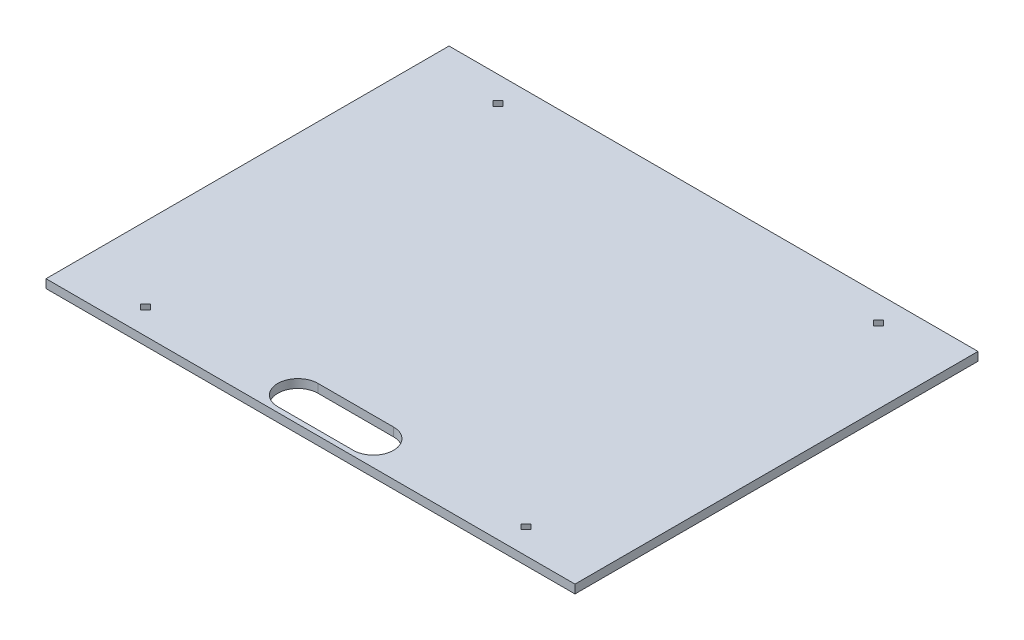
ISO-10303-21;
HEADER;
FILE_DESCRIPTION(('STEP AP214'),'2;1');
FILE_NAME('part.step','',(''),(''),'','','');
FILE_SCHEMA(('AUTOMOTIVE_DESIGN { 1 0 10303 214 1 1 1 1 }'));
ENDSEC;
DATA;
#1=APPLICATION_CONTEXT('core data for automotive mechanical design processes');
#2=APPLICATION_PROTOCOL_DEFINITION('international standard','automotive_design',2000,#1);
#3=PRODUCT_CONTEXT('',#1,'mechanical');
#4=PRODUCT('Part','Part','',(#3));
#5=PRODUCT_RELATED_PRODUCT_CATEGORY('part','',(#4));
#6=PRODUCT_DEFINITION_FORMATION('','',#4);
#7=PRODUCT_DEFINITION_CONTEXT('part definition',#1,'design');
#8=PRODUCT_DEFINITION('design','',#6,#7);
#9=PRODUCT_DEFINITION_SHAPE('','',#8);
#10=(LENGTH_UNIT() NAMED_UNIT(*) SI_UNIT(.MILLI.,.METRE.));
#11=(NAMED_UNIT(*) PLANE_ANGLE_UNIT() SI_UNIT($,.RADIAN.));
#12=(NAMED_UNIT(*) SI_UNIT($,.STERADIAN.) SOLID_ANGLE_UNIT());
#13=UNCERTAINTY_MEASURE_WITH_UNIT(LENGTH_MEASURE(1.E-05),#10,'distance_accuracy_value','');
#14=(GEOMETRIC_REPRESENTATION_CONTEXT(3) GLOBAL_UNCERTAINTY_ASSIGNED_CONTEXT((#13)) GLOBAL_UNIT_ASSIGNED_CONTEXT((#10,
#11,#12)) REPRESENTATION_CONTEXT('',''));
#15=CARTESIAN_POINT('',(0.,0.,0.));
#16=DIRECTION('',(0.,0.,1.));
#17=DIRECTION('',(1.,0.,0.));
#18=AXIS2_PLACEMENT_3D('',#15,#16,#17);
#19=CARTESIAN_POINT('',(0.,1.70233786755635,0.));
#20=DIRECTION('',(0.,1.,0.));
#21=DIRECTION('',(0.,0.,1.));
#22=AXIS2_PLACEMENT_3D('',#19,#20,#21);
#23=PLANE('',#22);
#24=DIRECTION('',(0.,0.,-1.));
#25=VECTOR('',#24,1.);
#26=CARTESIAN_POINT('',(52.5,1.70233786755635,-40.));
#27=LINE('',#26,#25);
#28=CARTESIAN_POINT('',(52.5,1.70233786755635,40.));
#29=VERTEX_POINT('',#28);
#30=CARTESIAN_POINT('',(52.5,1.70233786755635,-40.));
#31=VERTEX_POINT('',#30);
#32=EDGE_CURVE('E362',#29,#31,#27,.T.);
#33=ORIENTED_EDGE('',*,*,#32,.T.);
#34=DIRECTION('',(-1.,0.,0.));
#35=VECTOR('',#34,1.);
#36=CARTESIAN_POINT('',(-52.5,1.70233786755635,-40.));
#37=LINE('',#36,#35);
#38=CARTESIAN_POINT('',(-52.5,1.70233786755635,-40.));
#39=VERTEX_POINT('',#38);
#40=EDGE_CURVE('E365',#31,#39,#37,.T.);
#41=ORIENTED_EDGE('',*,*,#40,.T.);
#42=DIRECTION('',(0.,0.,1.));
#43=VECTOR('',#42,1.);
#44=CARTESIAN_POINT('',(-52.5,1.70233786755635,-40.));
#45=LINE('',#44,#43);
#46=CARTESIAN_POINT('',(-52.5,1.70233786755635,40.));
#47=VERTEX_POINT('',#46);
#48=EDGE_CURVE('E368',#39,#47,#45,.T.);
#49=ORIENTED_EDGE('',*,*,#48,.T.);
#50=DIRECTION('',(1.,0.,0.));
#51=VECTOR('',#50,1.);
#52=CARTESIAN_POINT('',(-52.5,1.70233786755635,40.));
#53=LINE('',#52,#51);
#54=EDGE_CURVE('E370',#47,#29,#53,.T.);
#55=ORIENTED_EDGE('',*,*,#54,.T.);
#56=EDGE_LOOP('',(#33,#41,#49,#55));
#57=FACE_BOUND('',#56,.T.);
#58=DIRECTION('',(0.707106781186547,0.,-0.707106781186547));
#59=VECTOR('',#58,1.);
#60=CARTESIAN_POINT('',(-37.7592881778876,1.70233786755635,-34.));
#61=LINE('',#60,#59);
#62=CARTESIAN_POINT('',(-37.7592881778876,1.70233786755635,-34.));
#63=VERTEX_POINT('',#62);
#64=CARTESIAN_POINT('',(-36.7592881778876,1.70233786755635,-35.));
#65=VERTEX_POINT('',#64);
#66=EDGE_CURVE('E333',#63,#65,#61,.T.);
#67=ORIENTED_EDGE('',*,*,#66,.F.);
#68=DIRECTION('',(0.707106781186547,0.,0.707106781186547));
#69=VECTOR('',#68,1.);
#70=CARTESIAN_POINT('',(-38.7592881778876,1.70233786755635,-35.));
#71=LINE('',#70,#69);
#72=CARTESIAN_POINT('',(-38.7592881778876,1.70233786755635,-35.));
#73=VERTEX_POINT('',#72);
#74=EDGE_CURVE('E331',#73,#63,#71,.T.);
#75=ORIENTED_EDGE('',*,*,#74,.F.);
#76=DIRECTION('',(-0.707106781186545,0.,0.70710678118655));
#77=VECTOR('',#76,1.);
#78=CARTESIAN_POINT('',(-37.7592881778876,1.70233786755635,-36.));
#79=LINE('',#78,#77);
#80=CARTESIAN_POINT('',(-37.7592881778876,1.70233786755635,-36.));
#81=VERTEX_POINT('',#80);
#82=EDGE_CURVE('E339',#81,#73,#79,.T.);
#83=ORIENTED_EDGE('',*,*,#82,.F.);
#84=DIRECTION('',(-0.70710678118655,0.,-0.707106781186545));
#85=VECTOR('',#84,1.);
#86=CARTESIAN_POINT('',(-36.7592881778876,1.70233786755635,-35.));
#87=LINE('',#86,#85);
#88=EDGE_CURVE('E336',#65,#81,#87,.T.);
#89=ORIENTED_EDGE('',*,*,#88,.F.);
#90=EDGE_LOOP('',(#67,#75,#83,#89));
#91=FACE_BOUND('',#90,.T.);
#92=DIRECTION('',(-0.70710678118655,0.,0.707106781186545));
#93=VECTOR('',#92,1.);
#94=CARTESIAN_POINT('',(36.7592881778876,1.70233786755635,-35.));
#95=LINE('',#94,#93);
#96=CARTESIAN_POINT('',(37.7592881778876,1.70233786755635,-36.));
#97=VERTEX_POINT('',#96);
#98=CARTESIAN_POINT('',(36.7592881778876,1.70233786755635,-35.));
#99=VERTEX_POINT('',#98);
#100=EDGE_CURVE('E302',#97,#99,#95,.T.);
#101=ORIENTED_EDGE('',*,*,#100,.F.);
#102=DIRECTION('',(-0.707106781186545,0.,-0.70710678118655));
#103=VECTOR('',#102,1.);
#104=CARTESIAN_POINT('',(37.7592881778876,1.70233786755635,-36.));
#105=LINE('',#104,#103);
#106=CARTESIAN_POINT('',(38.7592881778876,1.70233786755635,-35.));
#107=VERTEX_POINT('',#106);
#108=EDGE_CURVE('E300',#107,#97,#105,.T.);
#109=ORIENTED_EDGE('',*,*,#108,.F.);
#110=DIRECTION('',(0.707106781186547,0.,-0.707106781186547));
#111=VECTOR('',#110,1.);
#112=CARTESIAN_POINT('',(38.7592881778876,1.70233786755635,-35.));
#113=LINE('',#112,#111);
#114=CARTESIAN_POINT('',(37.7592881778876,1.70233786755635,-34.));
#115=VERTEX_POINT('',#114);
#116=EDGE_CURVE('E308',#115,#107,#113,.T.);
#117=ORIENTED_EDGE('',*,*,#116,.F.);
#118=DIRECTION('',(0.707106781186547,0.,0.707106781186547));
#119=VECTOR('',#118,1.);
#120=CARTESIAN_POINT('',(37.7592881778876,1.70233786755635,-34.));
#121=LINE('',#120,#119);
#122=EDGE_CURVE('E305',#99,#115,#121,.T.);
#123=ORIENTED_EDGE('',*,*,#122,.F.);
#124=EDGE_LOOP('',(#101,#109,#117,#123));
#125=FACE_BOUND('',#124,.T.);
#126=DIRECTION('',(0.707106781186545,0.,-0.70710678118655));
#127=VECTOR('',#126,1.);
#128=CARTESIAN_POINT('',(37.7592881778876,1.70233786755635,36.));
#129=LINE('',#128,#127);
#130=CARTESIAN_POINT('',(37.7592881778876,1.70233786755635,36.));
#131=VERTEX_POINT('',#130);
#132=CARTESIAN_POINT('',(38.7592881778876,1.70233786755635,35.));
#133=VERTEX_POINT('',#132);
#134=EDGE_CURVE('E271',#131,#133,#129,.T.);
#135=ORIENTED_EDGE('',*,*,#134,.F.);
#136=DIRECTION('',(0.70710678118655,0.,0.707106781186545));
#137=VECTOR('',#136,1.);
#138=CARTESIAN_POINT('',(36.7592881778876,1.70233786755635,35.));
#139=LINE('',#138,#137);
#140=CARTESIAN_POINT('',(36.7592881778876,1.70233786755635,35.));
#141=VERTEX_POINT('',#140);
#142=EDGE_CURVE('E269',#141,#131,#139,.T.);
#143=ORIENTED_EDGE('',*,*,#142,.F.);
#144=DIRECTION('',(-0.707106781186547,0.,0.707106781186547));
#145=VECTOR('',#144,1.);
#146=CARTESIAN_POINT('',(37.7592881778876,1.70233786755635,34.));
#147=LINE('',#146,#145);
#148=CARTESIAN_POINT('',(37.7592881778876,1.70233786755635,34.));
#149=VERTEX_POINT('',#148);
#150=EDGE_CURVE('E277',#149,#141,#147,.T.);
#151=ORIENTED_EDGE('',*,*,#150,.F.);
#152=DIRECTION('',(-0.707106781186547,0.,-0.707106781186547));
#153=VECTOR('',#152,1.);
#154=CARTESIAN_POINT('',(38.7592881778876,1.70233786755635,35.));
#155=LINE('',#154,#153);
#156=EDGE_CURVE('E274',#133,#149,#155,.T.);
#157=ORIENTED_EDGE('',*,*,#156,.F.);
#158=EDGE_LOOP('',(#135,#143,#151,#157));
#159=FACE_BOUND('',#158,.T.);
#160=DIRECTION('',(0.70710678118655,0.,-0.707106781186545));
#161=VECTOR('',#160,1.);
#162=CARTESIAN_POINT('',(-36.7592881778876,1.70233786755635,35.));
#163=LINE('',#162,#161);
#164=CARTESIAN_POINT('',(-37.7592881778876,1.70233786755635,36.));
#165=VERTEX_POINT('',#164);
#166=CARTESIAN_POINT('',(-36.7592881778876,1.70233786755635,35.));
#167=VERTEX_POINT('',#166);
#168=EDGE_CURVE('E240',#165,#167,#163,.T.);
#169=ORIENTED_EDGE('',*,*,#168,.F.);
#170=DIRECTION('',(0.707106781186545,0.,0.70710678118655));
#171=VECTOR('',#170,1.);
#172=CARTESIAN_POINT('',(-37.7592881778876,1.70233786755635,36.));
#173=LINE('',#172,#171);
#174=CARTESIAN_POINT('',(-38.7592881778876,1.70233786755635,35.));
#175=VERTEX_POINT('',#174);
#176=EDGE_CURVE('E238',#175,#165,#173,.T.);
#177=ORIENTED_EDGE('',*,*,#176,.F.);
#178=DIRECTION('',(-0.707106781186547,0.,0.707106781186547));
#179=VECTOR('',#178,1.);
#180=CARTESIAN_POINT('',(-38.7592881778876,1.70233786755635,35.));
#181=LINE('',#180,#179);
#182=CARTESIAN_POINT('',(-37.7592881778876,1.70233786755635,34.));
#183=VERTEX_POINT('',#182);
#184=EDGE_CURVE('E246',#183,#175,#181,.T.);
#185=ORIENTED_EDGE('',*,*,#184,.F.);
#186=DIRECTION('',(-0.707106781186547,0.,-0.707106781186547));
#187=VECTOR('',#186,1.);
#188=CARTESIAN_POINT('',(-37.7592881778876,1.70233786755635,34.));
#189=LINE('',#188,#187);
#190=EDGE_CURVE('E243',#167,#183,#189,.T.);
#191=ORIENTED_EDGE('',*,*,#190,.F.);
#192=EDGE_LOOP('',(#169,#177,#185,#191));
#193=FACE_BOUND('',#192,.T.);
#194=DIRECTION('',(1.,0.,0.));
#195=VECTOR('',#194,1.);
#196=CARTESIAN_POINT('',(-7.5,1.70233786755635,39.));
#197=LINE('',#196,#195);
#198=CARTESIAN_POINT('',(-7.5,1.70233786755635,39.));
#199=VERTEX_POINT('',#198);
#200=CARTESIAN_POINT('',(7.5,1.70233786755635,39.));
#201=VERTEX_POINT('',#200);
#202=EDGE_CURVE('E210',#199,#201,#197,.T.);
#203=ORIENTED_EDGE('',*,*,#202,.F.);
#204=CARTESIAN_POINT('',(-7.5,1.70233786755635,35.));
#205=DIRECTION('',(0.,1.,0.));
#206=DIRECTION('',(0.,0.,-1.));
#207=AXIS2_PLACEMENT_3D('',#204,#205,#206);
#208=CIRCLE('',#207,4.);
#209=CARTESIAN_POINT('',(-7.5,1.70233786755635,31.));
#210=VERTEX_POINT('',#209);
#211=EDGE_CURVE('E202',#210,#199,#208,.T.);
#212=ORIENTED_EDGE('',*,*,#211,.F.);
#213=DIRECTION('',(-1.,0.,0.));
#214=VECTOR('',#213,1.);
#215=CARTESIAN_POINT('',(-7.5,1.70233786755635,31.));
#216=LINE('',#215,#214);
#217=CARTESIAN_POINT('',(7.5,1.70233786755635,31.));
#218=VERTEX_POINT('',#217);
#219=EDGE_CURVE('E224',#218,#210,#216,.T.);
#220=ORIENTED_EDGE('',*,*,#219,.F.);
#221=CARTESIAN_POINT('',(7.5,1.70233786755635,35.));
#222=DIRECTION('',(0.,1.,0.));
#223=DIRECTION('',(0.,0.,-1.));
#224=AXIS2_PLACEMENT_3D('',#221,#222,#223);
#225=CIRCLE('',#224,4.);
#226=EDGE_CURVE('E222',#201,#218,#225,.T.);
#227=ORIENTED_EDGE('',*,*,#226,.F.);
#228=EDGE_LOOP('',(#203,#212,#220,#227));
#229=FACE_BOUND('',#228,.T.);
#230=ADVANCED_FACE('F41',(#57,#91,#125,#159,#193,#229),#23,.T.);
#231=CARTESIAN_POINT('',(0.,0.,0.));
#232=DIRECTION('',(0.,1.,0.));
#233=DIRECTION('',(0.,0.,1.));
#234=AXIS2_PLACEMENT_3D('',#231,#232,#233);
#235=PLANE('',#234);
#236=DIRECTION('',(0.707106781186545,0.,0.70710678118655));
#237=VECTOR('',#236,1.);
#238=CARTESIAN_POINT('',(-37.7592881778876,0.,36.));
#239=LINE('',#238,#237);
#240=CARTESIAN_POINT('',(-38.7592881778876,0.,35.));
#241=VERTEX_POINT('',#240);
#242=CARTESIAN_POINT('',(-37.7592881778876,0.,36.));
#243=VERTEX_POINT('',#242);
#244=EDGE_CURVE('E218',#241,#243,#239,.T.);
#245=ORIENTED_EDGE('',*,*,#244,.T.);
#246=DIRECTION('',(0.70710678118655,0.,-0.707106781186545));
#247=VECTOR('',#246,1.);
#248=CARTESIAN_POINT('',(-36.7592881778876,0.,35.));
#249=LINE('',#248,#247);
#250=CARTESIAN_POINT('',(-36.7592881778876,0.,35.));
#251=VERTEX_POINT('',#250);
#252=EDGE_CURVE('E251',#243,#251,#249,.T.);
#253=ORIENTED_EDGE('',*,*,#252,.T.);
#254=DIRECTION('',(-0.707106781186547,0.,-0.707106781186547));
#255=VECTOR('',#254,1.);
#256=CARTESIAN_POINT('',(-37.7592881778876,0.,34.));
#257=LINE('',#256,#255);
#258=CARTESIAN_POINT('',(-37.7592881778876,0.,34.));
#259=VERTEX_POINT('',#258);
#260=EDGE_CURVE('E254',#251,#259,#257,.T.);
#261=ORIENTED_EDGE('',*,*,#260,.T.);
#262=DIRECTION('',(-0.707106781186547,0.,0.707106781186547));
#263=VECTOR('',#262,1.);
#264=CARTESIAN_POINT('',(-38.7592881778876,0.,35.));
#265=LINE('',#264,#263);
#266=EDGE_CURVE('E241',#259,#241,#265,.T.);
#267=ORIENTED_EDGE('',*,*,#266,.T.);
#268=EDGE_LOOP('',(#245,#253,#261,#267));
#269=FACE_BOUND('',#268,.T.);
#270=DIRECTION('',(-0.707106781186545,0.,-0.70710678118655));
#271=VECTOR('',#270,1.);
#272=CARTESIAN_POINT('',(37.7592881778876,0.,-36.));
#273=LINE('',#272,#271);
#274=CARTESIAN_POINT('',(38.7592881778876,0.,-35.));
#275=VERTEX_POINT('',#274);
#276=CARTESIAN_POINT('',(37.7592881778876,0.,-36.));
#277=VERTEX_POINT('',#276);
#278=EDGE_CURVE('E299',#275,#277,#273,.T.);
#279=ORIENTED_EDGE('',*,*,#278,.T.);
#280=DIRECTION('',(-0.70710678118655,0.,0.707106781186545));
#281=VECTOR('',#280,1.);
#282=CARTESIAN_POINT('',(36.7592881778876,0.,-35.));
#283=LINE('',#282,#281);
#284=CARTESIAN_POINT('',(36.7592881778876,0.,-35.));
#285=VERTEX_POINT('',#284);
#286=EDGE_CURVE('E313',#277,#285,#283,.T.);
#287=ORIENTED_EDGE('',*,*,#286,.T.);
#288=DIRECTION('',(0.707106781186547,0.,0.707106781186547));
#289=VECTOR('',#288,1.);
#290=CARTESIAN_POINT('',(37.7592881778876,0.,-34.));
#291=LINE('',#290,#289);
#292=CARTESIAN_POINT('',(37.7592881778876,0.,-34.));
#293=VERTEX_POINT('',#292);
#294=EDGE_CURVE('E316',#285,#293,#291,.T.);
#295=ORIENTED_EDGE('',*,*,#294,.T.);
#296=DIRECTION('',(0.707106781186547,0.,-0.707106781186547));
#297=VECTOR('',#296,1.);
#298=CARTESIAN_POINT('',(38.7592881778876,0.,-35.));
#299=LINE('',#298,#297);
#300=EDGE_CURVE('E303',#293,#275,#299,.T.);
#301=ORIENTED_EDGE('',*,*,#300,.T.);
#302=EDGE_LOOP('',(#279,#287,#295,#301));
#303=FACE_BOUND('',#302,.T.);
#304=DIRECTION('',(0.,0.,-1.));
#305=VECTOR('',#304,1.);
#306=CARTESIAN_POINT('',(52.5,0.,-40.));
#307=LINE('',#306,#305);
#308=CARTESIAN_POINT('',(52.5,0.,40.));
#309=VERTEX_POINT('',#308);
#310=CARTESIAN_POINT('',(52.5,0.,-40.));
#311=VERTEX_POINT('',#310);
#312=EDGE_CURVE('E361',#309,#311,#307,.T.);
#313=ORIENTED_EDGE('',*,*,#312,.F.);
#314=DIRECTION('',(1.,0.,0.));
#315=VECTOR('',#314,1.);
#316=CARTESIAN_POINT('',(-52.5,0.,40.));
#317=LINE('',#316,#315);
#318=CARTESIAN_POINT('',(-52.5,0.,40.));
#319=VERTEX_POINT('',#318);
#320=EDGE_CURVE('E366',#319,#309,#317,.T.);
#321=ORIENTED_EDGE('',*,*,#320,.F.);
#322=DIRECTION('',(0.,0.,1.));
#323=VECTOR('',#322,1.);
#324=CARTESIAN_POINT('',(-52.5,0.,-40.));
#325=LINE('',#324,#323);
#326=CARTESIAN_POINT('',(-52.5,0.,-40.));
#327=VERTEX_POINT('',#326);
#328=EDGE_CURVE('E377',#327,#319,#325,.T.);
#329=ORIENTED_EDGE('',*,*,#328,.F.);
#330=DIRECTION('',(-1.,0.,0.));
#331=VECTOR('',#330,1.);
#332=CARTESIAN_POINT('',(-52.5,0.,-40.));
#333=LINE('',#332,#331);
#334=EDGE_CURVE('E375',#311,#327,#333,.T.);
#335=ORIENTED_EDGE('',*,*,#334,.F.);
#336=EDGE_LOOP('',(#313,#321,#329,#335));
#337=FACE_BOUND('',#336,.T.);
#338=DIRECTION('',(0.707106781186547,0.,0.707106781186547));
#339=VECTOR('',#338,1.);
#340=CARTESIAN_POINT('',(-38.7592881778876,0.,-35.));
#341=LINE('',#340,#339);
#342=CARTESIAN_POINT('',(-38.7592881778876,0.,-35.));
#343=VERTEX_POINT('',#342);
#344=CARTESIAN_POINT('',(-37.7592881778876,0.,-34.));
#345=VERTEX_POINT('',#344);
#346=EDGE_CURVE('E330',#343,#345,#341,.T.);
#347=ORIENTED_EDGE('',*,*,#346,.T.);
#348=DIRECTION('',(0.707106781186547,0.,-0.707106781186547));
#349=VECTOR('',#348,1.);
#350=CARTESIAN_POINT('',(-37.7592881778876,0.,-34.));
#351=LINE('',#350,#349);
#352=CARTESIAN_POINT('',(-36.7592881778876,0.,-35.));
#353=VERTEX_POINT('',#352);
#354=EDGE_CURVE('E344',#345,#353,#351,.T.);
#355=ORIENTED_EDGE('',*,*,#354,.T.);
#356=DIRECTION('',(-0.70710678118655,0.,-0.707106781186545));
#357=VECTOR('',#356,1.);
#358=CARTESIAN_POINT('',(-36.7592881778876,0.,-35.));
#359=LINE('',#358,#357);
#360=CARTESIAN_POINT('',(-37.7592881778876,0.,-36.));
#361=VERTEX_POINT('',#360);
#362=EDGE_CURVE('E347',#353,#361,#359,.T.);
#363=ORIENTED_EDGE('',*,*,#362,.T.);
#364=DIRECTION('',(-0.707106781186545,0.,0.70710678118655));
#365=VECTOR('',#364,1.);
#366=CARTESIAN_POINT('',(-37.7592881778876,0.,-36.));
#367=LINE('',#366,#365);
#368=EDGE_CURVE('E334',#361,#343,#367,.T.);
#369=ORIENTED_EDGE('',*,*,#368,.T.);
#370=EDGE_LOOP('',(#347,#355,#363,#369));
#371=FACE_BOUND('',#370,.T.);
#372=DIRECTION('',(0.70710678118655,0.,0.707106781186545));
#373=VECTOR('',#372,1.);
#374=CARTESIAN_POINT('',(36.7592881778876,0.,35.));
#375=LINE('',#374,#373);
#376=CARTESIAN_POINT('',(36.7592881778876,0.,35.));
#377=VERTEX_POINT('',#376);
#378=CARTESIAN_POINT('',(37.7592881778876,0.,36.));
#379=VERTEX_POINT('',#378);
#380=EDGE_CURVE('E268',#377,#379,#375,.T.);
#381=ORIENTED_EDGE('',*,*,#380,.T.);
#382=DIRECTION('',(0.707106781186545,0.,-0.70710678118655));
#383=VECTOR('',#382,1.);
#384=CARTESIAN_POINT('',(37.7592881778876,0.,36.));
#385=LINE('',#384,#383);
#386=CARTESIAN_POINT('',(38.7592881778876,0.,35.));
#387=VERTEX_POINT('',#386);
#388=EDGE_CURVE('E282',#379,#387,#385,.T.);
#389=ORIENTED_EDGE('',*,*,#388,.T.);
#390=DIRECTION('',(-0.707106781186547,0.,-0.707106781186547));
#391=VECTOR('',#390,1.);
#392=CARTESIAN_POINT('',(38.7592881778876,0.,35.));
#393=LINE('',#392,#391);
#394=CARTESIAN_POINT('',(37.7592881778876,0.,34.));
#395=VERTEX_POINT('',#394);
#396=EDGE_CURVE('E285',#387,#395,#393,.T.);
#397=ORIENTED_EDGE('',*,*,#396,.T.);
#398=DIRECTION('',(-0.707106781186547,0.,0.707106781186547));
#399=VECTOR('',#398,1.);
#400=CARTESIAN_POINT('',(37.7592881778876,0.,34.));
#401=LINE('',#400,#399);
#402=EDGE_CURVE('E272',#395,#377,#401,.T.);
#403=ORIENTED_EDGE('',*,*,#402,.T.);
#404=EDGE_LOOP('',(#381,#389,#397,#403));
#405=FACE_BOUND('',#404,.T.);
#406=CARTESIAN_POINT('',(-7.5,0.,35.));
#407=DIRECTION('',(0.,1.,0.));
#408=DIRECTION('',(0.,0.,-1.));
#409=AXIS2_PLACEMENT_3D('',#406,#407,#408);
#410=CIRCLE('',#409,4.);
#411=CARTESIAN_POINT('',(-7.5,0.,31.));
#412=VERTEX_POINT('',#411);
#413=CARTESIAN_POINT('',(-7.5,0.,39.));
#414=VERTEX_POINT('',#413);
#415=EDGE_CURVE('E64',#412,#414,#410,.T.);
#416=ORIENTED_EDGE('',*,*,#415,.T.);
#417=DIRECTION('',(1.,0.,0.));
#418=VECTOR('',#417,1.);
#419=CARTESIAN_POINT('',(-7.5,0.,39.));
#420=LINE('',#419,#418);
#421=CARTESIAN_POINT('',(7.5,0.,39.));
#422=VERTEX_POINT('',#421);
#423=EDGE_CURVE('E217',#414,#422,#420,.T.);
#424=ORIENTED_EDGE('',*,*,#423,.T.);
#425=CARTESIAN_POINT('',(7.5,0.,35.));
#426=DIRECTION('',(0.,1.,0.));
#427=DIRECTION('',(0.,0.,-1.));
#428=AXIS2_PLACEMENT_3D('',#425,#426,#427);
#429=CIRCLE('',#428,4.);
#430=CARTESIAN_POINT('',(7.5,0.,31.));
#431=VERTEX_POINT('',#430);
#432=EDGE_CURVE('E230',#422,#431,#429,.T.);
#433=ORIENTED_EDGE('',*,*,#432,.T.);
#434=DIRECTION('',(-1.,0.,0.));
#435=VECTOR('',#434,1.);
#436=CARTESIAN_POINT('',(-7.5,0.,31.));
#437=LINE('',#436,#435);
#438=EDGE_CURVE('E211',#431,#412,#437,.T.);
#439=ORIENTED_EDGE('',*,*,#438,.T.);
#440=EDGE_LOOP('',(#416,#424,#433,#439));
#441=FACE_BOUND('',#440,.T.);
#442=ADVANCED_FACE('F395',(#269,#303,#337,#371,#405,#441),#235,.F.);
#443=CARTESIAN_POINT('',(52.5,1.70233786755635,-40.));
#444=DIRECTION('',(-1.,0.,0.));
#445=DIRECTION('',(0.,0.,1.));
#446=AXIS2_PLACEMENT_3D('',#443,#444,#445);
#447=PLANE('',#446);
#448=ORIENTED_EDGE('',*,*,#312,.T.);
#449=DIRECTION('',(0.,-1.,0.));
#450=VECTOR('',#449,1.);
#451=CARTESIAN_POINT('',(52.5,1.70233786755635,-40.));
#452=LINE('',#451,#450);
#453=EDGE_CURVE('E11',#31,#311,#452,.T.);
#454=ORIENTED_EDGE('',*,*,#453,.F.);
#455=ORIENTED_EDGE('',*,*,#32,.F.);
#456=DIRECTION('',(0.,-1.,0.));
#457=VECTOR('',#456,1.);
#458=CARTESIAN_POINT('',(52.5,1.70233786755635,40.));
#459=LINE('',#458,#457);
#460=EDGE_CURVE('E372',#29,#309,#459,.T.);
#461=ORIENTED_EDGE('',*,*,#460,.T.);
#462=EDGE_LOOP('',(#448,#454,#455,#461));
#463=FACE_BOUND('',#462,.T.);
#464=ADVANCED_FACE('F43',(#463),#447,.F.);
#465=CARTESIAN_POINT('',(-52.5,1.70233786755635,-40.));
#466=DIRECTION('',(0.,0.,1.));
#467=DIRECTION('',(1.,0.,0.));
#468=AXIS2_PLACEMENT_3D('',#465,#466,#467);
#469=PLANE('',#468);
#470=ORIENTED_EDGE('',*,*,#334,.T.);
#471=DIRECTION('',(0.,-1.,0.));
#472=VECTOR('',#471,1.);
#473=CARTESIAN_POINT('',(-52.5,1.70233786755635,-40.));
#474=LINE('',#473,#472);
#475=EDGE_CURVE('E49',#39,#327,#474,.T.);
#476=ORIENTED_EDGE('',*,*,#475,.F.);
#477=ORIENTED_EDGE('',*,*,#40,.F.);
#478=ORIENTED_EDGE('',*,*,#453,.T.);
#479=EDGE_LOOP('',(#470,#476,#477,#478));
#480=FACE_BOUND('',#479,.T.);
#481=ADVANCED_FACE('F406',(#480),#469,.F.);
#482=CARTESIAN_POINT('',(-52.5,1.70233786755635,-40.));
#483=DIRECTION('',(1.,0.,0.));
#484=DIRECTION('',(0.,0.,-1.));
#485=AXIS2_PLACEMENT_3D('',#482,#483,#484);
#486=PLANE('',#485);
#487=ORIENTED_EDGE('',*,*,#328,.T.);
#488=DIRECTION('',(0.,-1.,0.));
#489=VECTOR('',#488,1.);
#490=CARTESIAN_POINT('',(-52.5,1.70233786755635,40.));
#491=LINE('',#490,#489);
#492=EDGE_CURVE('E382',#47,#319,#491,.T.);
#493=ORIENTED_EDGE('',*,*,#492,.F.);
#494=ORIENTED_EDGE('',*,*,#48,.F.);
#495=ORIENTED_EDGE('',*,*,#475,.T.);
#496=EDGE_LOOP('',(#487,#493,#494,#495));
#497=FACE_BOUND('',#496,.T.);
#498=ADVANCED_FACE('F389',(#497),#486,.F.);
#499=CARTESIAN_POINT('',(-52.5,1.70233786755635,40.));
#500=DIRECTION('',(0.,0.,-1.));
#501=DIRECTION('',(-1.,0.,0.));
#502=AXIS2_PLACEMENT_3D('',#499,#500,#501);
#503=PLANE('',#502);
#504=ORIENTED_EDGE('',*,*,#320,.T.);
#505=ORIENTED_EDGE('',*,*,#460,.F.);
#506=ORIENTED_EDGE('',*,*,#54,.F.);
#507=ORIENTED_EDGE('',*,*,#492,.T.);
#508=EDGE_LOOP('',(#504,#505,#506,#507));
#509=FACE_BOUND('',#508,.T.);
#510=ADVANCED_FACE('F399',(#509),#503,.F.);
#511=CARTESIAN_POINT('',(-38.7592881778876,1.70233786755635,-35.));
#512=DIRECTION('',(0.707106781186548,0.,-0.707106781186548));
#513=DIRECTION('',(-0.707106781186548,0.,-0.707106781186548));
#514=AXIS2_PLACEMENT_3D('',#511,#512,#513);
#515=PLANE('',#514);
#516=ORIENTED_EDGE('',*,*,#346,.F.);
#517=DIRECTION('',(0.,-1.,0.));
#518=VECTOR('',#517,1.);
#519=CARTESIAN_POINT('',(-38.7592881778876,1.70233786755635,-35.));
#520=LINE('',#519,#518);
#521=EDGE_CURVE('E341',#73,#343,#520,.T.);
#522=ORIENTED_EDGE('',*,*,#521,.F.);
#523=ORIENTED_EDGE('',*,*,#74,.T.);
#524=DIRECTION('',(0.,-1.,0.));
#525=VECTOR('',#524,1.);
#526=CARTESIAN_POINT('',(-37.7592881778876,1.70233786755635,-34.));
#527=LINE('',#526,#525);
#528=EDGE_CURVE('E358',#63,#345,#527,.T.);
#529=ORIENTED_EDGE('',*,*,#528,.T.);
#530=EDGE_LOOP('',(#516,#522,#523,#529));
#531=FACE_BOUND('',#530,.T.);
#532=ADVANCED_FACE('F421',(#531),#515,.T.);
#533=CARTESIAN_POINT('',(-37.7592881778876,1.70233786755635,-34.));
#534=DIRECTION('',(-0.707106781186548,0.,-0.707106781186548));
#535=DIRECTION('',(-0.707106781186548,0.,0.707106781186548));
#536=AXIS2_PLACEMENT_3D('',#533,#534,#535);
#537=PLANE('',#536);
#538=ORIENTED_EDGE('',*,*,#354,.F.);
#539=ORIENTED_EDGE('',*,*,#528,.F.);
#540=ORIENTED_EDGE('',*,*,#66,.T.);
#541=DIRECTION('',(0.,-1.,0.));
#542=VECTOR('',#541,1.);
#543=CARTESIAN_POINT('',(-36.7592881778876,1.70233786755635,-35.));
#544=LINE('',#543,#542);
#545=EDGE_CURVE('E356',#65,#353,#544,.T.);
#546=ORIENTED_EDGE('',*,*,#545,.T.);
#547=EDGE_LOOP('',(#538,#539,#540,#546));
#548=FACE_BOUND('',#547,.T.);
#549=ADVANCED_FACE('F428',(#548),#537,.T.);
#550=CARTESIAN_POINT('',(-36.7592881778876,1.70233786755635,-35.));
#551=DIRECTION('',(-0.707106781186545,0.,0.70710678118655));
#552=DIRECTION('',(0.70710678118655,0.,0.707106781186545));
#553=AXIS2_PLACEMENT_3D('',#550,#551,#552);
#554=PLANE('',#553);
#555=ORIENTED_EDGE('',*,*,#362,.F.);
#556=ORIENTED_EDGE('',*,*,#545,.F.);
#557=ORIENTED_EDGE('',*,*,#88,.T.);
#558=DIRECTION('',(0.,-1.,0.));
#559=VECTOR('',#558,1.);
#560=CARTESIAN_POINT('',(-37.7592881778876,1.70233786755635,-36.));
#561=LINE('',#560,#559);
#562=EDGE_CURVE('E354',#81,#361,#561,.T.);
#563=ORIENTED_EDGE('',*,*,#562,.T.);
#564=EDGE_LOOP('',(#555,#556,#557,#563));
#565=FACE_BOUND('',#564,.T.);
#566=ADVANCED_FACE('F433',(#565),#554,.T.);
#567=CARTESIAN_POINT('',(-37.7592881778876,1.70233786755635,-36.));
#568=DIRECTION('',(0.70710678118655,0.,0.707106781186545));
#569=DIRECTION('',(0.707106781186545,0.,-0.70710678118655));
#570=AXIS2_PLACEMENT_3D('',#567,#568,#569);
#571=PLANE('',#570);
#572=ORIENTED_EDGE('',*,*,#368,.F.);
#573=ORIENTED_EDGE('',*,*,#562,.F.);
#574=ORIENTED_EDGE('',*,*,#82,.T.);
#575=ORIENTED_EDGE('',*,*,#521,.T.);
#576=EDGE_LOOP('',(#572,#573,#574,#575));
#577=FACE_BOUND('',#576,.T.);
#578=ADVANCED_FACE('F440',(#577),#571,.T.);
#579=CARTESIAN_POINT('',(37.7592881778876,1.70233786755635,-36.));
#580=DIRECTION('',(-0.70710678118655,0.,0.707106781186545));
#581=DIRECTION('',(0.707106781186545,0.,0.70710678118655));
#582=AXIS2_PLACEMENT_3D('',#579,#580,#581);
#583=PLANE('',#582);
#584=ORIENTED_EDGE('',*,*,#278,.F.);
#585=DIRECTION('',(0.,-1.,0.));
#586=VECTOR('',#585,1.);
#587=CARTESIAN_POINT('',(38.7592881778876,1.70233786755635,-35.));
#588=LINE('',#587,#586);
#589=EDGE_CURVE('E310',#107,#275,#588,.T.);
#590=ORIENTED_EDGE('',*,*,#589,.F.);
#591=ORIENTED_EDGE('',*,*,#108,.T.);
#592=DIRECTION('',(0.,-1.,0.));
#593=VECTOR('',#592,1.);
#594=CARTESIAN_POINT('',(37.7592881778876,1.70233786755635,-36.));
#595=LINE('',#594,#593);
#596=EDGE_CURVE('E327',#97,#277,#595,.T.);
#597=ORIENTED_EDGE('',*,*,#596,.T.);
#598=EDGE_LOOP('',(#584,#590,#591,#597));
#599=FACE_BOUND('',#598,.T.);
#600=ADVANCED_FACE('F516',(#599),#583,.T.);
#601=CARTESIAN_POINT('',(36.7592881778876,1.70233786755635,-35.));
#602=DIRECTION('',(0.707106781186545,0.,0.70710678118655));
#603=DIRECTION('',(0.70710678118655,0.,-0.707106781186545));
#604=AXIS2_PLACEMENT_3D('',#601,#602,#603);
#605=PLANE('',#604);
#606=ORIENTED_EDGE('',*,*,#286,.F.);
#607=ORIENTED_EDGE('',*,*,#596,.F.);
#608=ORIENTED_EDGE('',*,*,#100,.T.);
#609=DIRECTION('',(0.,-1.,0.));
#610=VECTOR('',#609,1.);
#611=CARTESIAN_POINT('',(36.7592881778876,1.70233786755635,-35.));
#612=LINE('',#611,#610);
#613=EDGE_CURVE('E325',#99,#285,#612,.T.);
#614=ORIENTED_EDGE('',*,*,#613,.T.);
#615=EDGE_LOOP('',(#606,#607,#608,#614));
#616=FACE_BOUND('',#615,.T.);
#617=ADVANCED_FACE('F512',(#616),#605,.T.);
#618=CARTESIAN_POINT('',(37.7592881778876,1.70233786755635,-34.));
#619=DIRECTION('',(0.707106781186548,0.,-0.707106781186548));
#620=DIRECTION('',(-0.707106781186548,0.,-0.707106781186548));
#621=AXIS2_PLACEMENT_3D('',#618,#619,#620);
#622=PLANE('',#621);
#623=ORIENTED_EDGE('',*,*,#294,.F.);
#624=ORIENTED_EDGE('',*,*,#613,.F.);
#625=ORIENTED_EDGE('',*,*,#122,.T.);
#626=DIRECTION('',(0.,-1.,0.));
#627=VECTOR('',#626,1.);
#628=CARTESIAN_POINT('',(37.7592881778876,1.70233786755635,-34.));
#629=LINE('',#628,#627);
#630=EDGE_CURVE('E323',#115,#293,#629,.T.);
#631=ORIENTED_EDGE('',*,*,#630,.T.);
#632=EDGE_LOOP('',(#623,#624,#625,#631));
#633=FACE_BOUND('',#632,.T.);
#634=ADVANCED_FACE('F508',(#633),#622,.T.);
#635=CARTESIAN_POINT('',(38.7592881778876,1.70233786755635,-35.));
#636=DIRECTION('',(-0.707106781186548,0.,-0.707106781186548));
#637=DIRECTION('',(-0.707106781186548,0.,0.707106781186548));
#638=AXIS2_PLACEMENT_3D('',#635,#636,#637);
#639=PLANE('',#638);
#640=ORIENTED_EDGE('',*,*,#300,.F.);
#641=ORIENTED_EDGE('',*,*,#630,.F.);
#642=ORIENTED_EDGE('',*,*,#116,.T.);
#643=ORIENTED_EDGE('',*,*,#589,.T.);
#644=EDGE_LOOP('',(#640,#641,#642,#643));
#645=FACE_BOUND('',#644,.T.);
#646=ADVANCED_FACE('F504',(#645),#639,.T.);
#647=CARTESIAN_POINT('',(36.7592881778876,1.70233786755635,35.));
#648=DIRECTION('',(0.707106781186545,0.,-0.70710678118655));
#649=DIRECTION('',(-0.70710678118655,0.,-0.707106781186545));
#650=AXIS2_PLACEMENT_3D('',#647,#648,#649);
#651=PLANE('',#650);
#652=ORIENTED_EDGE('',*,*,#380,.F.);
#653=DIRECTION('',(0.,-1.,0.));
#654=VECTOR('',#653,1.);
#655=CARTESIAN_POINT('',(36.7592881778876,1.70233786755635,35.));
#656=LINE('',#655,#654);
#657=EDGE_CURVE('E279',#141,#377,#656,.T.);
#658=ORIENTED_EDGE('',*,*,#657,.F.);
#659=ORIENTED_EDGE('',*,*,#142,.T.);
#660=DIRECTION('',(0.,-1.,0.));
#661=VECTOR('',#660,1.);
#662=CARTESIAN_POINT('',(37.7592881778876,1.70233786755635,36.));
#663=LINE('',#662,#661);
#664=EDGE_CURVE('E296',#131,#379,#663,.T.);
#665=ORIENTED_EDGE('',*,*,#664,.T.);
#666=EDGE_LOOP('',(#652,#658,#659,#665));
#667=FACE_BOUND('',#666,.T.);
#668=ADVANCED_FACE('F500',(#667),#651,.T.);
#669=CARTESIAN_POINT('',(37.7592881778876,1.70233786755635,36.));
#670=DIRECTION('',(-0.70710678118655,0.,-0.707106781186545));
#671=DIRECTION('',(-0.707106781186545,0.,0.70710678118655));
#672=AXIS2_PLACEMENT_3D('',#669,#670,#671);
#673=PLANE('',#672);
#674=ORIENTED_EDGE('',*,*,#388,.F.);
#675=ORIENTED_EDGE('',*,*,#664,.F.);
#676=ORIENTED_EDGE('',*,*,#134,.T.);
#677=DIRECTION('',(0.,-1.,0.));
#678=VECTOR('',#677,1.);
#679=CARTESIAN_POINT('',(38.7592881778876,1.70233786755635,35.));
#680=LINE('',#679,#678);
#681=EDGE_CURVE('E294',#133,#387,#680,.T.);
#682=ORIENTED_EDGE('',*,*,#681,.T.);
#683=EDGE_LOOP('',(#674,#675,#676,#682));
#684=FACE_BOUND('',#683,.T.);
#685=ADVANCED_FACE('F496',(#684),#673,.T.);
#686=CARTESIAN_POINT('',(38.7592881778876,1.70233786755635,35.));
#687=DIRECTION('',(-0.707106781186548,0.,0.707106781186548));
#688=DIRECTION('',(0.707106781186548,0.,0.707106781186548));
#689=AXIS2_PLACEMENT_3D('',#686,#687,#688);
#690=PLANE('',#689);
#691=ORIENTED_EDGE('',*,*,#396,.F.);
#692=ORIENTED_EDGE('',*,*,#681,.F.);
#693=ORIENTED_EDGE('',*,*,#156,.T.);
#694=DIRECTION('',(0.,-1.,0.));
#695=VECTOR('',#694,1.);
#696=CARTESIAN_POINT('',(37.7592881778876,1.70233786755635,34.));
#697=LINE('',#696,#695);
#698=EDGE_CURVE('E292',#149,#395,#697,.T.);
#699=ORIENTED_EDGE('',*,*,#698,.T.);
#700=EDGE_LOOP('',(#691,#692,#693,#699));
#701=FACE_BOUND('',#700,.T.);
#702=ADVANCED_FACE('F492',(#701),#690,.T.);
#703=CARTESIAN_POINT('',(37.7592881778876,1.70233786755635,34.));
#704=DIRECTION('',(0.707106781186548,0.,0.707106781186548));
#705=DIRECTION('',(0.707106781186548,0.,-0.707106781186548));
#706=AXIS2_PLACEMENT_3D('',#703,#704,#705);
#707=PLANE('',#706);
#708=ORIENTED_EDGE('',*,*,#402,.F.);
#709=ORIENTED_EDGE('',*,*,#698,.F.);
#710=ORIENTED_EDGE('',*,*,#150,.T.);
#711=ORIENTED_EDGE('',*,*,#657,.T.);
#712=EDGE_LOOP('',(#708,#709,#710,#711));
#713=FACE_BOUND('',#712,.T.);
#714=ADVANCED_FACE('F489',(#713),#707,.T.);
#715=CARTESIAN_POINT('',(-37.7592881778876,1.70233786755635,36.));
#716=DIRECTION('',(0.70710678118655,0.,-0.707106781186545));
#717=DIRECTION('',(-0.707106781186545,0.,-0.70710678118655));
#718=AXIS2_PLACEMENT_3D('',#715,#716,#717);
#719=PLANE('',#718);
#720=ORIENTED_EDGE('',*,*,#244,.F.);
#721=DIRECTION('',(0.,-1.,0.));
#722=VECTOR('',#721,1.);
#723=CARTESIAN_POINT('',(-38.7592881778876,1.70233786755635,35.));
#724=LINE('',#723,#722);
#725=EDGE_CURVE('E248',#175,#241,#724,.T.);
#726=ORIENTED_EDGE('',*,*,#725,.F.);
#727=ORIENTED_EDGE('',*,*,#176,.T.);
#728=DIRECTION('',(0.,-1.,0.));
#729=VECTOR('',#728,1.);
#730=CARTESIAN_POINT('',(-37.7592881778876,1.70233786755635,36.));
#731=LINE('',#730,#729);
#732=EDGE_CURVE('E265',#165,#243,#731,.T.);
#733=ORIENTED_EDGE('',*,*,#732,.T.);
#734=EDGE_LOOP('',(#720,#726,#727,#733));
#735=FACE_BOUND('',#734,.T.);
#736=ADVANCED_FACE('F471',(#735),#719,.T.);
#737=CARTESIAN_POINT('',(-36.7592881778876,1.70233786755635,35.));
#738=DIRECTION('',(-0.707106781186545,0.,-0.70710678118655));
#739=DIRECTION('',(-0.70710678118655,0.,0.707106781186545));
#740=AXIS2_PLACEMENT_3D('',#737,#738,#739);
#741=PLANE('',#740);
#742=ORIENTED_EDGE('',*,*,#252,.F.);
#743=ORIENTED_EDGE('',*,*,#732,.F.);
#744=ORIENTED_EDGE('',*,*,#168,.T.);
#745=DIRECTION('',(0.,-1.,0.));
#746=VECTOR('',#745,1.);
#747=CARTESIAN_POINT('',(-36.7592881778876,1.70233786755635,35.));
#748=LINE('',#747,#746);
#749=EDGE_CURVE('E263',#167,#251,#748,.T.);
#750=ORIENTED_EDGE('',*,*,#749,.T.);
#751=EDGE_LOOP('',(#742,#743,#744,#750));
#752=FACE_BOUND('',#751,.T.);
#753=ADVANCED_FACE('F464',(#752),#741,.T.);
#754=CARTESIAN_POINT('',(-37.7592881778876,1.70233786755635,34.));
#755=DIRECTION('',(-0.707106781186548,0.,0.707106781186548));
#756=DIRECTION('',(0.707106781186548,0.,0.707106781186548));
#757=AXIS2_PLACEMENT_3D('',#754,#755,#756);
#758=PLANE('',#757);
#759=ORIENTED_EDGE('',*,*,#260,.F.);
#760=ORIENTED_EDGE('',*,*,#749,.F.);
#761=ORIENTED_EDGE('',*,*,#190,.T.);
#762=DIRECTION('',(0.,-1.,0.));
#763=VECTOR('',#762,1.);
#764=CARTESIAN_POINT('',(-37.7592881778876,1.70233786755635,34.));
#765=LINE('',#764,#763);
#766=EDGE_CURVE('E261',#183,#259,#765,.T.);
#767=ORIENTED_EDGE('',*,*,#766,.T.);
#768=EDGE_LOOP('',(#759,#760,#761,#767));
#769=FACE_BOUND('',#768,.T.);
#770=ADVANCED_FACE('F467',(#769),#758,.T.);
#771=CARTESIAN_POINT('',(-38.7592881778876,1.70233786755635,35.));
#772=DIRECTION('',(0.707106781186548,0.,0.707106781186548));
#773=DIRECTION('',(0.707106781186548,0.,-0.707106781186548));
#774=AXIS2_PLACEMENT_3D('',#771,#772,#773);
#775=PLANE('',#774);
#776=ORIENTED_EDGE('',*,*,#266,.F.);
#777=ORIENTED_EDGE('',*,*,#766,.F.);
#778=ORIENTED_EDGE('',*,*,#184,.T.);
#779=ORIENTED_EDGE('',*,*,#725,.T.);
#780=EDGE_LOOP('',(#776,#777,#778,#779));
#781=FACE_BOUND('',#780,.T.);
#782=ADVANCED_FACE('F474',(#781),#775,.T.);
#783=CARTESIAN_POINT('',(-7.5,1.70233786755635,35.));
#784=DIRECTION('',(0.,-1.,0.));
#785=DIRECTION('',(0.,0.,-1.));
#786=AXIS2_PLACEMENT_3D('',#783,#784,#785);
#787=CYLINDRICAL_SURFACE('',#786,4.);
#788=ORIENTED_EDGE('',*,*,#415,.F.);
#789=DIRECTION('',(0.,-1.,0.));
#790=VECTOR('',#789,1.);
#791=CARTESIAN_POINT('',(-7.5,1.70233786755635,31.));
#792=LINE('',#791,#790);
#793=EDGE_CURVE('E206',#210,#412,#792,.T.);
#794=ORIENTED_EDGE('',*,*,#793,.F.);
#795=ORIENTED_EDGE('',*,*,#211,.T.);
#796=DIRECTION('',(0.,-1.,0.));
#797=VECTOR('',#796,1.);
#798=CARTESIAN_POINT('',(-7.5,1.70233786755635,39.));
#799=LINE('',#798,#797);
#800=EDGE_CURVE('E205',#199,#414,#799,.T.);
#801=ORIENTED_EDGE('',*,*,#800,.T.);
#802=EDGE_LOOP('',(#788,#794,#795,#801));
#803=FACE_BOUND('',#802,.T.);
#804=ADVANCED_FACE('F204',(#803),#787,.F.);
#805=CARTESIAN_POINT('',(-7.5,1.70233786755635,39.));
#806=DIRECTION('',(0.,0.,-1.));
#807=DIRECTION('',(-1.,0.,0.));
#808=AXIS2_PLACEMENT_3D('',#805,#806,#807);
#809=PLANE('',#808);
#810=ORIENTED_EDGE('',*,*,#423,.F.);
#811=ORIENTED_EDGE('',*,*,#800,.F.);
#812=ORIENTED_EDGE('',*,*,#202,.T.);
#813=DIRECTION('',(0.,-1.,0.));
#814=VECTOR('',#813,1.);
#815=CARTESIAN_POINT('',(7.5,1.70233786755635,39.));
#816=LINE('',#815,#814);
#817=EDGE_CURVE('E219',#201,#422,#816,.T.);
#818=ORIENTED_EDGE('',*,*,#817,.T.);
#819=EDGE_LOOP('',(#810,#811,#812,#818));
#820=FACE_BOUND('',#819,.T.);
#821=ADVANCED_FACE('F214',(#820),#809,.T.);
#822=CARTESIAN_POINT('',(7.5,1.70233786755635,35.));
#823=DIRECTION('',(0.,-1.,0.));
#824=DIRECTION('',(0.,0.,-1.));
#825=AXIS2_PLACEMENT_3D('',#822,#823,#824);
#826=CYLINDRICAL_SURFACE('',#825,4.);
#827=ORIENTED_EDGE('',*,*,#432,.F.);
#828=ORIENTED_EDGE('',*,*,#817,.F.);
#829=ORIENTED_EDGE('',*,*,#226,.T.);
#830=DIRECTION('',(0.,-1.,0.));
#831=VECTOR('',#830,1.);
#832=CARTESIAN_POINT('',(7.5,1.70233786755635,31.));
#833=LINE('',#832,#831);
#834=EDGE_CURVE('E56',#218,#431,#833,.T.);
#835=ORIENTED_EDGE('',*,*,#834,.T.);
#836=EDGE_LOOP('',(#827,#828,#829,#835));
#837=FACE_BOUND('',#836,.T.);
#838=ADVANCED_FACE('F608',(#837),#826,.F.);
#839=CARTESIAN_POINT('',(-7.5,1.70233786755635,31.));
#840=DIRECTION('',(0.,0.,1.));
#841=DIRECTION('',(1.,0.,0.));
#842=AXIS2_PLACEMENT_3D('',#839,#840,#841);
#843=PLANE('',#842);
#844=ORIENTED_EDGE('',*,*,#438,.F.);
#845=ORIENTED_EDGE('',*,*,#834,.F.);
#846=ORIENTED_EDGE('',*,*,#219,.T.);
#847=ORIENTED_EDGE('',*,*,#793,.T.);
#848=EDGE_LOOP('',(#844,#845,#846,#847));
#849=FACE_BOUND('',#848,.T.);
#850=ADVANCED_FACE('F616',(#849),#843,.T.);
#851=CLOSED_SHELL('',(#230,#442,#464,#481,#498,#510,#532,#549,#566,#578,#600,#617,#634,#646,
#668,#685,#702,#714,#736,#753,#770,#782,#804,#821,#838,#850));
#852=MANIFOLD_SOLID_BREP('B2',#851);
#853=ADVANCED_BREP_SHAPE_REPRESENTATION('',(#18,#852),#14);
#854=SHAPE_DEFINITION_REPRESENTATION(#9,#853);
ENDSEC;
END-ISO-10303-21;
